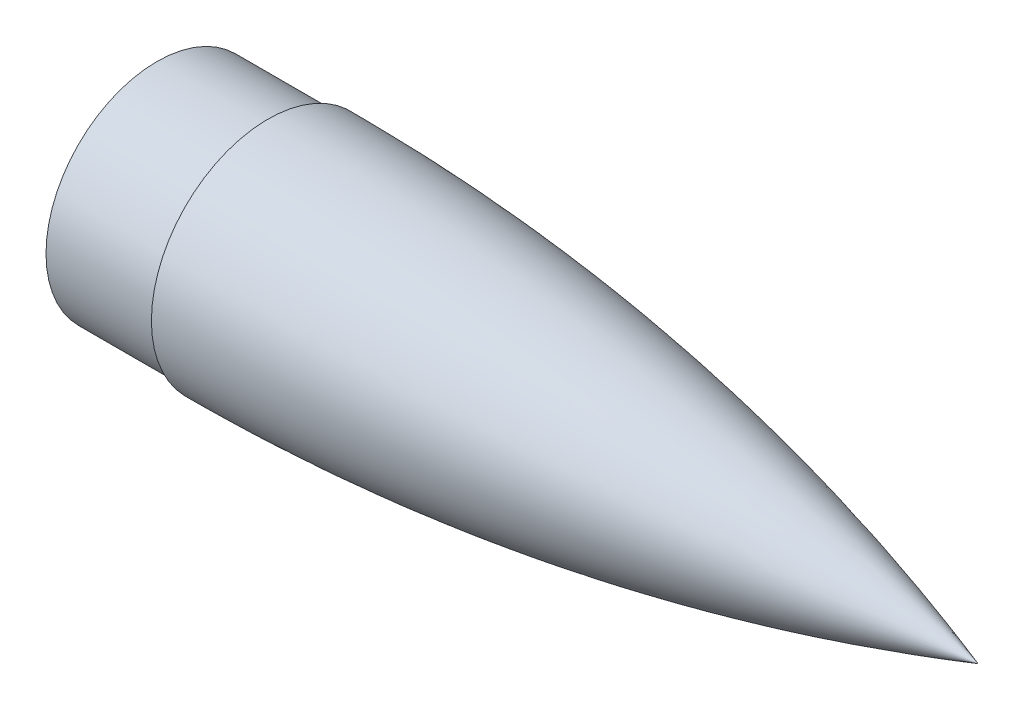
ISO-10303-21;
HEADER;
FILE_DESCRIPTION(('STEP AP214'),'2;1');
FILE_NAME('part.step','',(''),(''),'','','');
FILE_SCHEMA(('AUTOMOTIVE_DESIGN { 1 0 10303 214 1 1 1 1 }'));
ENDSEC;
DATA;
#1=APPLICATION_CONTEXT('core data for automotive mechanical design processes');
#2=APPLICATION_PROTOCOL_DEFINITION('international standard','automotive_design',2000,#1);
#3=PRODUCT_CONTEXT('',#1,'mechanical');
#4=PRODUCT('Part','Part','',(#3));
#5=PRODUCT_RELATED_PRODUCT_CATEGORY('part','',(#4));
#6=PRODUCT_DEFINITION_FORMATION('','',#4);
#7=PRODUCT_DEFINITION_CONTEXT('part definition',#1,'design');
#8=PRODUCT_DEFINITION('design','',#6,#7);
#9=PRODUCT_DEFINITION_SHAPE('','',#8);
#10=(LENGTH_UNIT() NAMED_UNIT(*) SI_UNIT(.MILLI.,.METRE.));
#11=(NAMED_UNIT(*) PLANE_ANGLE_UNIT() SI_UNIT($,.RADIAN.));
#12=(NAMED_UNIT(*) SI_UNIT($,.STERADIAN.) SOLID_ANGLE_UNIT());
#13=UNCERTAINTY_MEASURE_WITH_UNIT(LENGTH_MEASURE(1.E-05),#10,'distance_accuracy_value','');
#14=(GEOMETRIC_REPRESENTATION_CONTEXT(3) GLOBAL_UNCERTAINTY_ASSIGNED_CONTEXT((#13)) GLOBAL_UNIT_ASSIGNED_CONTEXT((#10,
#11,#12)) REPRESENTATION_CONTEXT('',''));
#15=CARTESIAN_POINT('',(0.,0.,0.));
#16=DIRECTION('',(0.,0.,1.));
#17=DIRECTION('',(1.,0.,0.));
#18=AXIS2_PLACEMENT_3D('',#15,#16,#17);
#19=CARTESIAN_POINT('',(63.5,0.,-63.5));
#20=DIRECTION('',(1.,0.,0.));
#21=DIRECTION('',(0.,0.,-1.));
#22=AXIS2_PLACEMENT_3D('',#19,#20,#21);
#23=PLANE('',#22);
#24=CARTESIAN_POINT('',(63.5,0.,0.));
#25=DIRECTION('',(-1.,0.,0.));
#26=DIRECTION('',(0.,0.,1.));
#27=AXIS2_PLACEMENT_3D('',#24,#25,#26);
#28=CIRCLE('',#27,63.5);
#29=CARTESIAN_POINT('',(63.5,0.,63.5));
#30=VERTEX_POINT('',#29);
#31=EDGE_CURVE('E72',#30,#30,#28,.T.);
#32=ORIENTED_EDGE('',*,*,#31,.F.);
#33=EDGE_LOOP('',(#32));
#34=FACE_BOUND('',#33,.T.);
#35=CARTESIAN_POINT('',(63.5,0.,0.));
#36=DIRECTION('',(-1.,0.,0.));
#37=DIRECTION('',(0.,0.,1.));
#38=AXIS2_PLACEMENT_3D('',#35,#36,#37);
#39=CIRCLE('',#38,66.675);
#40=CARTESIAN_POINT('',(63.5,0.,66.675));
#41=VERTEX_POINT('',#40);
#42=EDGE_CURVE('E11',#41,#41,#39,.T.);
#43=ORIENTED_EDGE('',*,*,#42,.T.);
#44=EDGE_LOOP('',(#43));
#45=FACE_BOUND('',#44,.T.);
#46=ADVANCED_FACE('F39',(#34,#45),#23,.F.);
#47=CARTESIAN_POINT('',(63.5,0.,-1205.21488095238));
#48=DIRECTION('',(0.,-1.,0.));
#49=DIRECTION('',(0.,0.,1.));
#50=AXIS2_PLACEMENT_3D('',#47,#48,#49);
#51=CIRCLE('',#50,1271.88988095238);
#52=TRIMMED_CURVE('',#51,(PARAMETER_VALUE(-0.325227657195897)),
(PARAMETER_VALUE(0.325227657195897)),.T.,.PARAMETER.);
#53=CARTESIAN_POINT('',(63.5,0.,0.));
#54=DIRECTION('',(-1.,0.,0.));
#55=AXIS1_PLACEMENT('',#53,#54);
#56=SURFACE_OF_REVOLUTION('',#52,#55);
#57=ORIENTED_EDGE('',*,*,#42,.F.);
#58=EDGE_LOOP('',(#57));
#59=FACE_BOUND('',#58,.T.);
#60=CARTESIAN_POINT('',(469.9,0.,0.));
#61=VERTEX_POINT('',#60);
#62=VERTEX_LOOP('',#61);
#63=FACE_BOUND('',#62,.T.);
#64=ADVANCED_FACE('F57',(#59,#63),#56,.T.);
#65=CARTESIAN_POINT('',(63.5,0.,-1205.21488095238));
#66=DIRECTION('',(0.,-1.,0.));
#67=DIRECTION('',(0.,0.,1.));
#68=AXIS2_PLACEMENT_3D('',#65,#66,#67);
#69=CIRCLE('',#68,1268.71488095238);
#70=TRIMMED_CURVE('',#69,(PARAMETER_VALUE(-0.317722587862064)),
(PARAMETER_VALUE(0.317722587862064)),.T.,.PARAMETER.);
#71=CARTESIAN_POINT('',(63.5,0.,0.));
#72=DIRECTION('',(-1.,0.,0.));
#73=AXIS1_PLACEMENT('',#71,#72);
#74=SURFACE_OF_REVOLUTION('',#70,#73);
#75=CARTESIAN_POINT('',(459.851535736841,0.,0.));
#76=VERTEX_POINT('',#75);
#77=VERTEX_LOOP('',#76);
#78=FACE_BOUND('',#77,.T.);
#79=CARTESIAN_POINT('',(66.675,0.,0.));
#80=DIRECTION('',(-1.,0.,0.));
#81=DIRECTION('',(0.,0.,1.));
#82=AXIS2_PLACEMENT_3D('',#79,#80,#81);
#83=CIRCLE('',#82,63.4960272237151);
#84=CARTESIAN_POINT('',(66.675,0.,63.4960272237151));
#85=VERTEX_POINT('',#84);
#86=EDGE_CURVE('E46',#85,#85,#83,.T.);
#87=ORIENTED_EDGE('',*,*,#86,.T.);
#88=EDGE_LOOP('',(#87));
#89=FACE_BOUND('',#88,.T.);
#90=ADVANCED_FACE('F55',(#78,#89),#74,.F.);
#91=CARTESIAN_POINT('',(66.675,0.,-60.325));
#92=DIRECTION('',(-1.,0.,0.));
#93=DIRECTION('',(0.,0.,1.));
#94=AXIS2_PLACEMENT_3D('',#91,#92,#93);
#95=PLANE('',#94);
#96=ORIENTED_EDGE('',*,*,#86,.F.);
#97=EDGE_LOOP('',(#96));
#98=FACE_BOUND('',#97,.T.);
#99=CARTESIAN_POINT('',(66.675,0.,0.));
#100=DIRECTION('',(-1.,0.,0.));
#101=DIRECTION('',(0.,0.,1.));
#102=AXIS2_PLACEMENT_3D('',#99,#100,#101);
#103=CIRCLE('',#102,60.325);
#104=CARTESIAN_POINT('',(66.675,0.,60.325));
#105=VERTEX_POINT('',#104);
#106=EDGE_CURVE('E62',#105,#105,#103,.T.);
#107=ORIENTED_EDGE('',*,*,#106,.T.);
#108=EDGE_LOOP('',(#107));
#109=FACE_BOUND('',#108,.T.);
#110=ADVANCED_FACE('F54',(#98,#109),#95,.F.);
#111=CARTESIAN_POINT('',(0.,0.,0.));
#112=DIRECTION('',(-1.,0.,0.));
#113=DIRECTION('',(0.,0.,1.));
#114=AXIS2_PLACEMENT_3D('',#111,#112,#113);
#115=CYLINDRICAL_SURFACE('',#114,60.325);
#116=ORIENTED_EDGE('',*,*,#106,.F.);
#117=EDGE_LOOP('',(#116));
#118=FACE_BOUND('',#117,.T.);
#119=CARTESIAN_POINT('',(0.,0.,0.));
#120=DIRECTION('',(-1.,0.,0.));
#121=DIRECTION('',(0.,0.,1.));
#122=AXIS2_PLACEMENT_3D('',#119,#120,#121);
#123=CIRCLE('',#122,60.325);
#124=CARTESIAN_POINT('',(0.,0.,60.325));
#125=VERTEX_POINT('',#124);
#126=EDGE_CURVE('E65',#125,#125,#123,.T.);
#127=ORIENTED_EDGE('',*,*,#126,.T.);
#128=EDGE_LOOP('',(#127));
#129=FACE_BOUND('',#128,.T.);
#130=ADVANCED_FACE('F87',(#118,#129),#115,.F.);
#131=CARTESIAN_POINT('',(0.,0.,-63.5));
#132=DIRECTION('',(1.,0.,0.));
#133=DIRECTION('',(0.,0.,-1.));
#134=AXIS2_PLACEMENT_3D('',#131,#132,#133);
#135=PLANE('',#134);
#136=ORIENTED_EDGE('',*,*,#126,.F.);
#137=EDGE_LOOP('',(#136));
#138=FACE_BOUND('',#137,.T.);
#139=CARTESIAN_POINT('',(0.,0.,0.));
#140=DIRECTION('',(-1.,0.,0.));
#141=DIRECTION('',(0.,0.,1.));
#142=AXIS2_PLACEMENT_3D('',#139,#140,#141);
#143=CIRCLE('',#142,63.5);
#144=CARTESIAN_POINT('',(0.,0.,63.5));
#145=VERTEX_POINT('',#144);
#146=EDGE_CURVE('E66',#145,#145,#143,.T.);
#147=ORIENTED_EDGE('',*,*,#146,.T.);
#148=EDGE_LOOP('',(#147));
#149=FACE_BOUND('',#148,.T.);
#150=ADVANCED_FACE('F89',(#138,#149),#135,.F.);
#151=CARTESIAN_POINT('',(0.,0.,0.));
#152=DIRECTION('',(-1.,0.,0.));
#153=DIRECTION('',(0.,0.,1.));
#154=AXIS2_PLACEMENT_3D('',#151,#152,#153);
#155=CYLINDRICAL_SURFACE('',#154,63.5);
#156=ORIENTED_EDGE('',*,*,#146,.F.);
#157=EDGE_LOOP('',(#156));
#158=FACE_BOUND('',#157,.T.);
#159=ORIENTED_EDGE('',*,*,#31,.T.);
#160=EDGE_LOOP('',(#159));
#161=FACE_BOUND('',#160,.T.);
#162=ADVANCED_FACE('F73',(#158,#161),#155,.T.);
#163=CLOSED_SHELL('',(#46,#64,#90,#110,#130,#150,#162));
#164=MANIFOLD_SOLID_BREP('B2',#163);
#165=ADVANCED_BREP_SHAPE_REPRESENTATION('',(#18,#164),#14);
#166=SHAPE_DEFINITION_REPRESENTATION(#9,#165);
ENDSEC;
END-ISO-10303-21;
